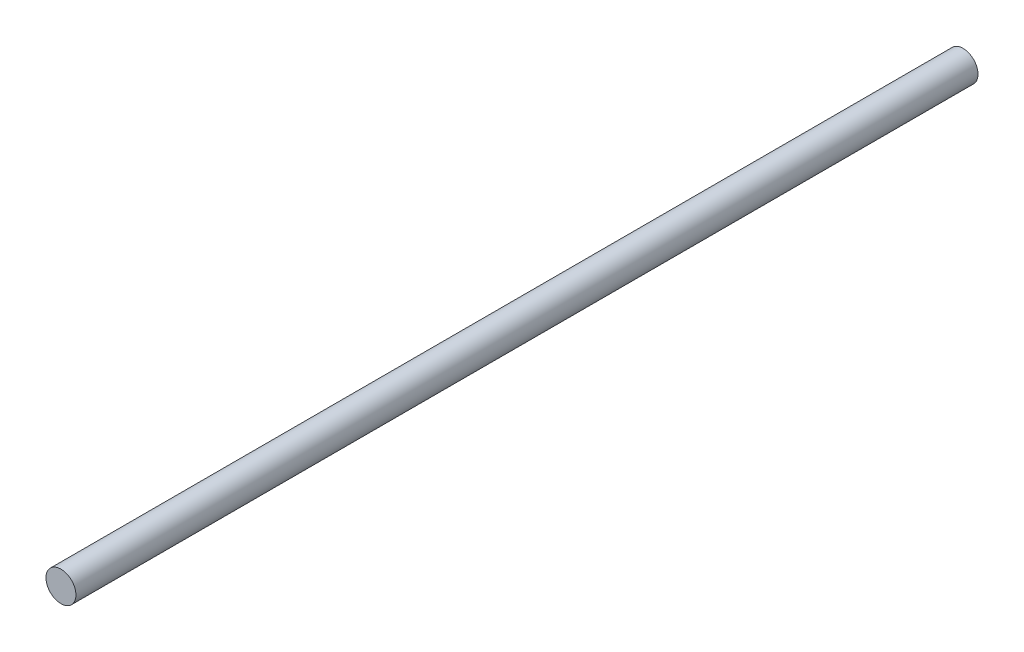
ISO-10303-21;
HEADER;
FILE_DESCRIPTION(('STEP AP214'),'2;1');
FILE_NAME('part.step','',(''),(''),'','','');
FILE_SCHEMA(('AUTOMOTIVE_DESIGN { 1 0 10303 214 1 1 1 1 }'));
ENDSEC;
DATA;
#1=APPLICATION_CONTEXT('core data for automotive mechanical design processes');
#2=APPLICATION_PROTOCOL_DEFINITION('international standard','automotive_design',2000,#1);
#3=PRODUCT_CONTEXT('',#1,'mechanical');
#4=PRODUCT('Part','Part','',(#3));
#5=PRODUCT_RELATED_PRODUCT_CATEGORY('part','',(#4));
#6=PRODUCT_DEFINITION_FORMATION('','',#4);
#7=PRODUCT_DEFINITION_CONTEXT('part definition',#1,'design');
#8=PRODUCT_DEFINITION('design','',#6,#7);
#9=PRODUCT_DEFINITION_SHAPE('','',#8);
#10=(LENGTH_UNIT() NAMED_UNIT(*) SI_UNIT(.MILLI.,.METRE.));
#11=(NAMED_UNIT(*) PLANE_ANGLE_UNIT() SI_UNIT($,.RADIAN.));
#12=(NAMED_UNIT(*) SI_UNIT($,.STERADIAN.) SOLID_ANGLE_UNIT());
#13=UNCERTAINTY_MEASURE_WITH_UNIT(LENGTH_MEASURE(1.E-05),#10,'distance_accuracy_value','');
#14=(GEOMETRIC_REPRESENTATION_CONTEXT(3) GLOBAL_UNCERTAINTY_ASSIGNED_CONTEXT((#13)) GLOBAL_UNIT_ASSIGNED_CONTEXT((#10,
#11,#12)) REPRESENTATION_CONTEXT('',''));
#15=CARTESIAN_POINT('',(0.,0.,0.));
#16=DIRECTION('',(0.,0.,1.));
#17=DIRECTION('',(1.,0.,0.));
#18=AXIS2_PLACEMENT_3D('',#15,#16,#17);
#19=CARTESIAN_POINT('',(0.,0.,381.));
#20=DIRECTION('',(0.,0.,-1.));
#21=DIRECTION('',(-1.,0.,0.));
#22=AXIS2_PLACEMENT_3D('',#19,#20,#21);
#23=CYLINDRICAL_SURFACE('',#22,6.3246);
#24=CARTESIAN_POINT('',(0.,0.,381.));
#25=DIRECTION('',(0.,0.,1.));
#26=DIRECTION('',(1.,0.,0.));
#27=AXIS2_PLACEMENT_3D('',#24,#25,#26);
#28=CIRCLE('',#27,6.3246);
#29=CARTESIAN_POINT('',(6.3246,0.,381.));
#30=VERTEX_POINT('',#29);
#31=EDGE_CURVE('E10',#30,#30,#28,.T.);
#32=ORIENTED_EDGE('',*,*,#31,.F.);
#33=EDGE_LOOP('',(#32));
#34=FACE_BOUND('',#33,.T.);
#35=CARTESIAN_POINT('',(0.,0.,0.));
#36=DIRECTION('',(0.,0.,1.));
#37=DIRECTION('',(1.,0.,0.));
#38=AXIS2_PLACEMENT_3D('',#35,#36,#37);
#39=CIRCLE('',#38,6.3246);
#40=CARTESIAN_POINT('',(6.3246,0.,0.));
#41=VERTEX_POINT('',#40);
#42=EDGE_CURVE('E34',#41,#41,#39,.T.);
#43=ORIENTED_EDGE('',*,*,#42,.T.);
#44=EDGE_LOOP('',(#43));
#45=FACE_BOUND('',#44,.T.);
#46=ADVANCED_FACE('F31',(#34,#45),#23,.T.);
#47=CARTESIAN_POINT('',(0.,0.,381.));
#48=DIRECTION('',(0.,0.,1.));
#49=DIRECTION('',(1.,0.,0.));
#50=AXIS2_PLACEMENT_3D('',#47,#48,#49);
#51=PLANE('',#50);
#52=ORIENTED_EDGE('',*,*,#31,.T.);
#53=EDGE_LOOP('',(#52));
#54=FACE_BOUND('',#53,.T.);
#55=ADVANCED_FACE('F46',(#54),#51,.T.);
#56=CARTESIAN_POINT('',(0.,0.,0.));
#57=DIRECTION('',(0.,0.,1.));
#58=DIRECTION('',(1.,0.,0.));
#59=AXIS2_PLACEMENT_3D('',#56,#57,#58);
#60=PLANE('',#59);
#61=ORIENTED_EDGE('',*,*,#42,.F.);
#62=EDGE_LOOP('',(#61));
#63=FACE_BOUND('',#62,.T.);
#64=ADVANCED_FACE('F44',(#63),#60,.F.);
#65=CLOSED_SHELL('',(#46,#55,#64));
#66=MANIFOLD_SOLID_BREP('B2',#65);
#67=ADVANCED_BREP_SHAPE_REPRESENTATION('',(#18,#66),#14);
#68=SHAPE_DEFINITION_REPRESENTATION(#9,#67);
ENDSEC;
END-ISO-10303-21;
